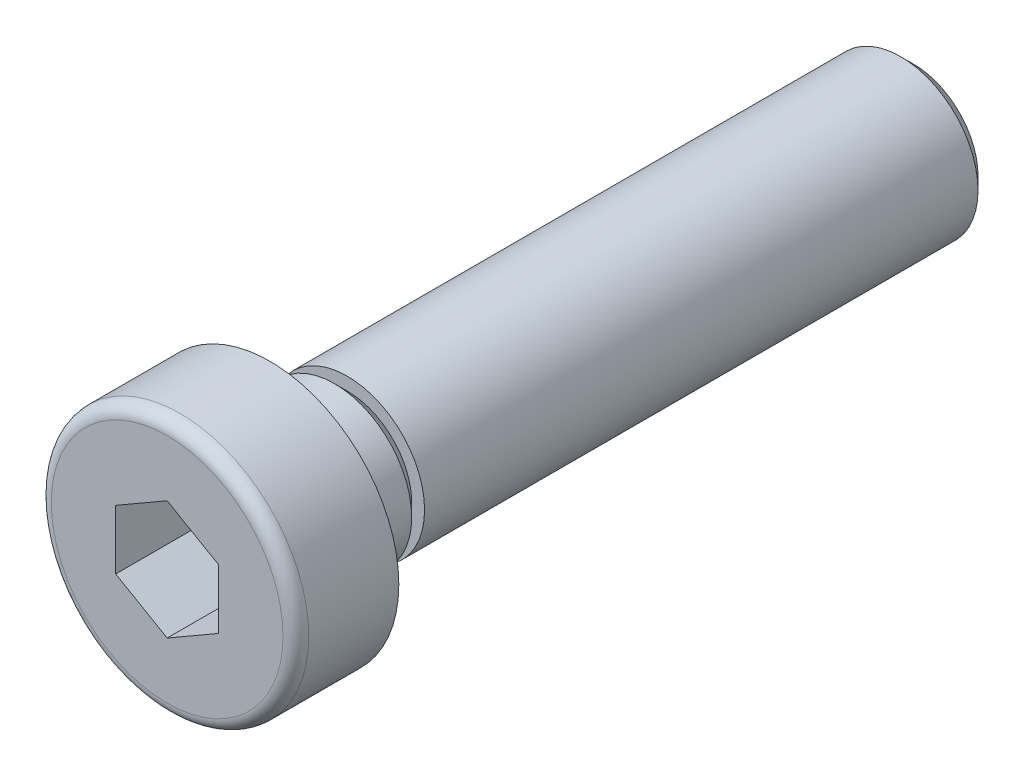
ISO-10303-21;
HEADER;
FILE_DESCRIPTION(('STEP AP214'),'2;1');
FILE_NAME('part.step','',(''),(''),'','','');
FILE_SCHEMA(('AUTOMOTIVE_DESIGN { 1 0 10303 214 1 1 1 1 }'));
ENDSEC;
DATA;
#1=APPLICATION_CONTEXT('core data for automotive mechanical design processes');
#2=APPLICATION_PROTOCOL_DEFINITION('international standard','automotive_design',2000,#1);
#3=PRODUCT_CONTEXT('',#1,'mechanical');
#4=PRODUCT('Part','Part','',(#3));
#5=PRODUCT_RELATED_PRODUCT_CATEGORY('part','',(#4));
#6=PRODUCT_DEFINITION_FORMATION('','',#4);
#7=PRODUCT_DEFINITION_CONTEXT('part definition',#1,'design');
#8=PRODUCT_DEFINITION('design','',#6,#7);
#9=PRODUCT_DEFINITION_SHAPE('','',#8);
#10=(LENGTH_UNIT() NAMED_UNIT(*) SI_UNIT(.MILLI.,.METRE.));
#11=(NAMED_UNIT(*) PLANE_ANGLE_UNIT() SI_UNIT($,.RADIAN.));
#12=(NAMED_UNIT(*) SI_UNIT($,.STERADIAN.) SOLID_ANGLE_UNIT());
#13=UNCERTAINTY_MEASURE_WITH_UNIT(LENGTH_MEASURE(1.E-05),#10,'distance_accuracy_value','');
#14=(GEOMETRIC_REPRESENTATION_CONTEXT(3) GLOBAL_UNCERTAINTY_ASSIGNED_CONTEXT((#13)) GLOBAL_UNIT_ASSIGNED_CONTEXT((#10,
#11,#12)) REPRESENTATION_CONTEXT('',''));
#15=CARTESIAN_POINT('',(0.,0.,0.));
#16=DIRECTION('',(0.,0.,1.));
#17=DIRECTION('',(1.,0.,0.));
#18=AXIS2_PLACEMENT_3D('',#15,#16,#17);
#19=CARTESIAN_POINT('',(-268.749668394775,-161.29907216884,-790.10814798632));
#20=DIRECTION('',(0.,0.,-1.));
#21=DIRECTION('',(-1.,0.,0.));
#22=AXIS2_PLACEMENT_3D('',#19,#20,#21);
#23=PLANE('',#22);
#24=DIRECTION('',(0.,1.,0.));
#25=VECTOR('',#24,1.);
#26=CARTESIAN_POINT('',(-266.749668394775,-161.29907216884,-790.10814798632));
#27=LINE('',#26,#25);
#28=CARTESIAN_POINT('',(-266.749668394775,-162.453772707219,-790.10814798632));
#29=VERTEX_POINT('',#28);
#30=CARTESIAN_POINT('',(-266.749668394775,-160.144371630462,-790.10814798632));
#31=VERTEX_POINT('',#30);
#32=EDGE_CURVE('E343',#29,#31,#27,.T.);
#33=ORIENTED_EDGE('',*,*,#32,.T.);
#34=DIRECTION('',(-0.866025403784439,0.5,0.));
#35=VECTOR('',#34,1.);
#36=CARTESIAN_POINT('',(-267.749668394776,-159.567021361272,-790.10814798632));
#37=LINE('',#36,#35);
#38=CARTESIAN_POINT('',(-268.749668394775,-158.989671092082,-790.10814798632));
#39=VERTEX_POINT('',#38);
#40=EDGE_CURVE('E358',#31,#39,#37,.T.);
#41=ORIENTED_EDGE('',*,*,#40,.T.);
#42=DIRECTION('',(-0.866025403784438,-0.5,0.));
#43=VECTOR('',#42,1.);
#44=CARTESIAN_POINT('',(-269.749668394776,-159.567021361272,-790.10814798632));
#45=LINE('',#44,#43);
#46=CARTESIAN_POINT('',(-270.749668394775,-160.144371630461,-790.10814798632));
#47=VERTEX_POINT('',#46);
#48=EDGE_CURVE('E328',#39,#47,#45,.T.);
#49=ORIENTED_EDGE('',*,*,#48,.T.);
#50=DIRECTION('',(0.,1.,0.));
#51=VECTOR('',#50,1.);
#52=CARTESIAN_POINT('',(-270.749668394775,-161.29907216884,-790.10814798632));
#53=LINE('',#52,#51);
#54=CARTESIAN_POINT('',(-270.749668394775,-162.45377270722,-790.10814798632));
#55=VERTEX_POINT('',#54);
#56=EDGE_CURVE('E80',#47,#55,#53,.F.);
#57=ORIENTED_EDGE('',*,*,#56,.T.);
#58=DIRECTION('',(0.866025403784439,-0.5,0.));
#59=VECTOR('',#58,1.);
#60=CARTESIAN_POINT('',(-269.749668394776,-163.031122976409,-790.10814798632));
#61=LINE('',#60,#59);
#62=CARTESIAN_POINT('',(-268.749668394776,-163.608473245599,-790.10814798632));
#63=VERTEX_POINT('',#62);
#64=EDGE_CURVE('E61',#55,#63,#61,.T.);
#65=ORIENTED_EDGE('',*,*,#64,.T.);
#66=DIRECTION('',(0.866025403784439,0.5,0.));
#67=VECTOR('',#66,1.);
#68=CARTESIAN_POINT('',(-267.749668394776,-163.031122976409,-790.10814798632));
#69=LINE('',#68,#67);
#70=EDGE_CURVE('E67',#63,#29,#69,.T.);
#71=ORIENTED_EDGE('',*,*,#70,.T.);
#72=EDGE_LOOP('',(#33,#41,#49,#57,#65,#71));
#73=FACE_BOUND('',#72,.T.);
#74=ADVANCED_FACE('F17',(#73),#23,.F.);
#75=CARTESIAN_POINT('',(-267.749668394776,-163.031122976409,-786.108147986318));
#76=DIRECTION('',(0.5,-0.866025403784439,0.));
#77=DIRECTION('',(0.866025403784439,0.5,0.));
#78=AXIS2_PLACEMENT_3D('',#75,#76,#77);
#79=PLANE('',#78);
#80=DIRECTION('',(0.,0.,1.));
#81=VECTOR('',#80,1.);
#82=CARTESIAN_POINT('',(-268.749668394775,-163.608473245599,-786.108147986318));
#83=LINE('',#82,#81);
#84=CARTESIAN_POINT('',(-268.749668394776,-163.608473245599,-786.108147986318));
#85=VERTEX_POINT('',#84);
#86=EDGE_CURVE('E71',#63,#85,#83,.T.);
#87=ORIENTED_EDGE('',*,*,#86,.T.);
#88=DIRECTION('',(-0.866025403784596,-0.499999999999727,0.));
#89=VECTOR('',#88,1.);
#90=CARTESIAN_POINT('',(-266.749668394775,-162.45377270722,-786.108147986318));
#91=LINE('',#90,#89);
#92=CARTESIAN_POINT('',(-266.749668394775,-162.453772707219,-786.108147986318));
#93=VERTEX_POINT('',#92);
#94=EDGE_CURVE('E340',#93,#85,#91,.T.);
#95=ORIENTED_EDGE('',*,*,#94,.F.);
#96=DIRECTION('',(0.,0.,1.));
#97=VECTOR('',#96,1.);
#98=CARTESIAN_POINT('',(-266.749668394775,-162.45377270722,-786.108147986318));
#99=LINE('',#98,#97);
#100=EDGE_CURVE('E74',#93,#29,#99,.F.);
#101=ORIENTED_EDGE('',*,*,#100,.T.);
#102=ORIENTED_EDGE('',*,*,#70,.F.);
#103=EDGE_LOOP('',(#87,#95,#101,#102));
#104=FACE_BOUND('',#103,.T.);
#105=ADVANCED_FACE('F68',(#104),#79,.F.);
#106=CARTESIAN_POINT('',(-269.749668394776,-163.031122976409,-786.108147986318));
#107=DIRECTION('',(-0.5,-0.866025403784439,0.));
#108=DIRECTION('',(0.866025403784439,-0.5,0.));
#109=AXIS2_PLACEMENT_3D('',#106,#107,#108);
#110=PLANE('',#109);
#111=DIRECTION('',(0.,0.,1.));
#112=VECTOR('',#111,1.);
#113=CARTESIAN_POINT('',(-270.749668394775,-162.45377270722,-786.108147986318));
#114=LINE('',#113,#112);
#115=CARTESIAN_POINT('',(-270.749668394775,-162.45377270722,-786.108147986318));
#116=VERTEX_POINT('',#115);
#117=EDGE_CURVE('E82',#55,#116,#114,.T.);
#118=ORIENTED_EDGE('',*,*,#117,.T.);
#119=DIRECTION('',(-0.86602540378438,0.500000000000102,0.));
#120=VECTOR('',#119,1.);
#121=CARTESIAN_POINT('',(-268.749668394776,-163.608473245599,-786.108147986318));
#122=LINE('',#121,#120);
#123=EDGE_CURVE('E86',#85,#116,#122,.T.);
#124=ORIENTED_EDGE('',*,*,#123,.F.);
#125=ORIENTED_EDGE('',*,*,#86,.F.);
#126=ORIENTED_EDGE('',*,*,#64,.F.);
#127=EDGE_LOOP('',(#118,#124,#125,#126));
#128=FACE_BOUND('',#127,.T.);
#129=ADVANCED_FACE('F84',(#128),#110,.F.);
#130=CARTESIAN_POINT('',(-270.749668394775,-161.29907216884,-786.108147986318));
#131=DIRECTION('',(-1.,0.,0.));
#132=DIRECTION('',(0.,0.,1.));
#133=AXIS2_PLACEMENT_3D('',#130,#131,#132);
#134=PLANE('',#133);
#135=DIRECTION('',(0.,0.,1.));
#136=VECTOR('',#135,1.);
#137=CARTESIAN_POINT('',(-270.749668394775,-160.144371630461,-786.108147986318));
#138=LINE('',#137,#136);
#139=CARTESIAN_POINT('',(-270.749668394775,-160.14437163046,-786.108147986318));
#140=VERTEX_POINT('',#139);
#141=EDGE_CURVE('E321',#47,#140,#138,.T.);
#142=ORIENTED_EDGE('',*,*,#141,.T.);
#143=DIRECTION('',(0.,1.,0.));
#144=VECTOR('',#143,1.);
#145=CARTESIAN_POINT('',(-270.749668394775,-158.79907216884,-786.108147986318));
#146=LINE('',#145,#144);
#147=EDGE_CURVE('E325',#116,#140,#146,.T.);
#148=ORIENTED_EDGE('',*,*,#147,.F.);
#149=ORIENTED_EDGE('',*,*,#117,.F.);
#150=ORIENTED_EDGE('',*,*,#56,.F.);
#151=EDGE_LOOP('',(#142,#148,#149,#150));
#152=FACE_BOUND('',#151,.T.);
#153=ADVANCED_FACE('F147',(#152),#134,.F.);
#154=CARTESIAN_POINT('',(-269.749668394776,-159.567021361272,-786.108147986318));
#155=DIRECTION('',(-0.5,0.866025403784438,0.));
#156=DIRECTION('',(-0.866025403784438,-0.5,0.));
#157=AXIS2_PLACEMENT_3D('',#154,#155,#156);
#158=PLANE('',#157);
#159=DIRECTION('',(0.,0.,1.));
#160=VECTOR('',#159,1.);
#161=CARTESIAN_POINT('',(-268.749668394776,-158.989671092082,-786.108147986318));
#162=LINE('',#161,#160);
#163=CARTESIAN_POINT('',(-268.749668394775,-158.989671092082,-786.108147986318));
#164=VERTEX_POINT('',#163);
#165=EDGE_CURVE('E334',#39,#164,#162,.T.);
#166=ORIENTED_EDGE('',*,*,#165,.T.);
#167=DIRECTION('',(0.866025403784488,0.499999999999914,0.));
#168=VECTOR('',#167,1.);
#169=CARTESIAN_POINT('',(-270.749668394775,-160.14437163046,-786.108147986318));
#170=LINE('',#169,#168);
#171=EDGE_CURVE('E332',#140,#164,#170,.T.);
#172=ORIENTED_EDGE('',*,*,#171,.F.);
#173=ORIENTED_EDGE('',*,*,#141,.F.);
#174=ORIENTED_EDGE('',*,*,#48,.F.);
#175=EDGE_LOOP('',(#166,#172,#173,#174));
#176=FACE_BOUND('',#175,.T.);
#177=ADVANCED_FACE('F143',(#176),#158,.F.);
#178=CARTESIAN_POINT('',(-267.749668394776,-159.567021361272,-786.108147986318));
#179=DIRECTION('',(0.5,0.866025403784439,0.));
#180=DIRECTION('',(-0.866025403784439,0.5,0.));
#181=AXIS2_PLACEMENT_3D('',#178,#179,#180);
#182=PLANE('',#181);
#183=DIRECTION('',(0.,0.,1.));
#184=VECTOR('',#183,1.);
#185=CARTESIAN_POINT('',(-266.749668394775,-160.144371630461,-786.108147986318));
#186=LINE('',#185,#184);
#187=CARTESIAN_POINT('',(-266.749668394775,-160.144371630462,-786.108147986318));
#188=VERTEX_POINT('',#187);
#189=EDGE_CURVE('E355',#31,#188,#186,.T.);
#190=ORIENTED_EDGE('',*,*,#189,.T.);
#191=DIRECTION('',(0.866025403784113,-0.500000000000563,0.));
#192=VECTOR('',#191,1.);
#193=CARTESIAN_POINT('',(-268.749668394775,-158.989671092081,-786.108147986318));
#194=LINE('',#193,#192);
#195=EDGE_CURVE('E337',#164,#188,#194,.T.);
#196=ORIENTED_EDGE('',*,*,#195,.F.);
#197=ORIENTED_EDGE('',*,*,#165,.F.);
#198=ORIENTED_EDGE('',*,*,#40,.F.);
#199=EDGE_LOOP('',(#190,#196,#197,#198));
#200=FACE_BOUND('',#199,.T.);
#201=ADVANCED_FACE('F139',(#200),#182,.F.);
#202=CARTESIAN_POINT('',(-266.749668394775,-161.29907216884,-786.108147986318));
#203=DIRECTION('',(1.,0.,0.));
#204=DIRECTION('',(0.,1.,0.));
#205=AXIS2_PLACEMENT_3D('',#202,#203,#204);
#206=PLANE('',#205);
#207=ORIENTED_EDGE('',*,*,#100,.F.);
#208=DIRECTION('',(0.,1.,0.));
#209=VECTOR('',#208,1.);
#210=CARTESIAN_POINT('',(-266.749668394775,-158.79907216884,-786.108147986318));
#211=LINE('',#210,#209);
#212=EDGE_CURVE('E111',#188,#93,#211,.F.);
#213=ORIENTED_EDGE('',*,*,#212,.F.);
#214=ORIENTED_EDGE('',*,*,#189,.F.);
#215=ORIENTED_EDGE('',*,*,#32,.F.);
#216=EDGE_LOOP('',(#207,#213,#214,#215));
#217=FACE_BOUND('',#216,.T.);
#218=ADVANCED_FACE('F131',(#217),#206,.F.);
#219=CARTESIAN_POINT('',(-268.749668394775,-158.79907216884,-786.108147986318));
#220=DIRECTION('',(0.,0.,1.));
#221=DIRECTION('',(1.,0.,0.));
#222=AXIS2_PLACEMENT_3D('',#219,#220,#221);
#223=PLANE('',#222);
#224=ORIENTED_EDGE('',*,*,#195,.T.);
#225=ORIENTED_EDGE('',*,*,#212,.T.);
#226=ORIENTED_EDGE('',*,*,#94,.T.);
#227=ORIENTED_EDGE('',*,*,#123,.T.);
#228=ORIENTED_EDGE('',*,*,#147,.T.);
#229=ORIENTED_EDGE('',*,*,#171,.T.);
#230=EDGE_LOOP('',(#224,#225,#226,#227,#228,#229));
#231=FACE_BOUND('',#230,.T.);
#232=CARTESIAN_POINT('',(-268.749668394775,-161.29907216884,-786.108147986318));
#233=DIRECTION('',(0.,0.,-1.));
#234=DIRECTION('',(1.,0.,0.));
#235=AXIS2_PLACEMENT_3D('',#232,#233,#234);
#236=CIRCLE('',#235,4.5);
#237=CARTESIAN_POINT('',(-264.249668394775,-161.29907216884,-786.108147986318));
#238=VERTEX_POINT('',#237);
#239=CARTESIAN_POINT('',(-273.249668394775,-161.29907216884,-786.108147986318));
#240=VERTEX_POINT('',#239);
#241=EDGE_CURVE('E36',#238,#240,#236,.T.);
#242=ORIENTED_EDGE('',*,*,#241,.F.);
#243=CARTESIAN_POINT('',(-268.749668394775,-161.29907216884,-786.108147986318));
#244=DIRECTION('',(0.,0.,-1.));
#245=DIRECTION('',(-1.,0.,0.));
#246=AXIS2_PLACEMENT_3D('',#243,#244,#245);
#247=CIRCLE('',#246,4.5);
#248=EDGE_CURVE('E109',#240,#238,#247,.T.);
#249=ORIENTED_EDGE('',*,*,#248,.F.);
#250=EDGE_LOOP('',(#242,#249));
#251=FACE_BOUND('',#250,.T.);
#252=ADVANCED_FACE('F113',(#231,#251),#223,.T.);
#253=CARTESIAN_POINT('',(-268.749668394775,-161.29907216884,-786.608147986318));
#254=DIRECTION('',(0.,0.,1.));
#255=DIRECTION('',(-1.,0.,0.));
#256=AXIS2_PLACEMENT_3D('',#253,#254,#255);
#257=TOROIDAL_SURFACE('',#256,4.5,0.499999999999999);
#258=ORIENTED_EDGE('',*,*,#241,.T.);
#259=ORIENTED_EDGE('',*,*,#248,.T.);
#260=EDGE_LOOP('',(#258,#259));
#261=FACE_BOUND('',#260,.T.);
#262=CARTESIAN_POINT('',(-268.749668394775,-161.29907216884,-786.608147986318));
#263=DIRECTION('',(0.,0.,1.));
#264=DIRECTION('',(1.,0.,0.));
#265=AXIS2_PLACEMENT_3D('',#262,#263,#264);
#266=CIRCLE('',#265,4.99999999999999);
#267=CARTESIAN_POINT('',(-263.749668394775,-161.29907216884,-786.608147986318));
#268=VERTEX_POINT('',#267);
#269=EDGE_CURVE('E105',#268,#268,#266,.F.);
#270=ORIENTED_EDGE('',*,*,#269,.F.);
#271=EDGE_LOOP('',(#270));
#272=FACE_BOUND('',#271,.T.);
#273=ADVANCED_FACE('F107',(#261,#272),#257,.T.);
#274=CARTESIAN_POINT('',(-268.749668394775,-161.29907216884,-788.10814798632));
#275=DIRECTION('',(0.,0.,1.));
#276=DIRECTION('',(1.,0.,0.));
#277=AXIS2_PLACEMENT_3D('',#274,#275,#276);
#278=CYLINDRICAL_SURFACE('',#277,4.99999999999999);
#279=CARTESIAN_POINT('',(-268.749668394775,-161.29907216884,-790.10814798632));
#280=DIRECTION('',(0.,0.,1.));
#281=DIRECTION('',(1.,0.,0.));
#282=AXIS2_PLACEMENT_3D('',#279,#280,#281);
#283=CIRCLE('',#282,4.99999999999999);
#284=CARTESIAN_POINT('',(-263.749668394775,-161.29907216884,-790.10814798632));
#285=VERTEX_POINT('',#284);
#286=EDGE_CURVE('E103',#285,#285,#283,.F.);
#287=ORIENTED_EDGE('',*,*,#286,.F.);
#288=EDGE_LOOP('',(#287));
#289=FACE_BOUND('',#288,.T.);
#290=ORIENTED_EDGE('',*,*,#269,.T.);
#291=EDGE_LOOP('',(#290));
#292=FACE_BOUND('',#291,.T.);
#293=ADVANCED_FACE('F188',(#289,#292),#278,.T.);
#294=CARTESIAN_POINT('',(-268.749668394775,-157.29907216884,-790.10814798632));
#295=DIRECTION('',(0.,0.,-1.));
#296=DIRECTION('',(-1.,0.,0.));
#297=AXIS2_PLACEMENT_3D('',#294,#295,#296);
#298=PLANE('',#297);
#299=CARTESIAN_POINT('',(-268.749668394775,-161.29907216884,-790.10814798632));
#300=DIRECTION('',(0.,0.,1.));
#301=DIRECTION('',(1.,0.,0.));
#302=AXIS2_PLACEMENT_3D('',#299,#300,#301);
#303=CIRCLE('',#302,2.99999999999999);
#304=CARTESIAN_POINT('',(-265.749668394775,-161.29907216884,-790.10814798632));
#305=VERTEX_POINT('',#304);
#306=EDGE_CURVE('E100',#305,#305,#303,.F.);
#307=ORIENTED_EDGE('',*,*,#306,.F.);
#308=EDGE_LOOP('',(#307));
#309=FACE_BOUND('',#308,.T.);
#310=ORIENTED_EDGE('',*,*,#286,.T.);
#311=EDGE_LOOP('',(#310));
#312=FACE_BOUND('',#311,.T.);
#313=ADVANCED_FACE('F185',(#309,#312),#298,.T.);
#314=CARTESIAN_POINT('',(-268.749668394775,-161.29907216884,-791.35814798632));
#315=DIRECTION('',(0.,0.,1.));
#316=DIRECTION('',(1.,0.,0.));
#317=AXIS2_PLACEMENT_3D('',#314,#315,#316);
#318=CYLINDRICAL_SURFACE('',#317,2.99999999999999);
#319=ORIENTED_EDGE('',*,*,#306,.T.);
#320=EDGE_LOOP('',(#319));
#321=FACE_BOUND('',#320,.T.);
#322=CARTESIAN_POINT('',(-268.749668394775,-161.29907216884,-792.608147986319));
#323=DIRECTION('',(0.,0.,1.));
#324=DIRECTION('',(0.,1.,0.));
#325=AXIS2_PLACEMENT_3D('',#322,#323,#324);
#326=CIRCLE('',#325,3.);
#327=CARTESIAN_POINT('',(-268.749668394775,-158.29907216884,-792.608147986319));
#328=VERTEX_POINT('',#327);
#329=EDGE_CURVE('E99',#328,#328,#326,.F.);
#330=ORIENTED_EDGE('',*,*,#329,.F.);
#331=EDGE_LOOP('',(#330));
#332=FACE_BOUND('',#331,.T.);
#333=ADVANCED_FACE('F181',(#321,#332),#318,.T.);
#334=CARTESIAN_POINT('',(-268.749668394775,-161.29907216884,-792.608147986319));
#335=DIRECTION('',(0.,0.,1.));
#336=DIRECTION('',(1.,0.,0.));
#337=AXIS2_PLACEMENT_3D('',#334,#335,#336);
#338=CONICAL_SURFACE('',#337,3.,0.785398163397448);
#339=CARTESIAN_POINT('',(-268.749668394775,-161.29907216884,-793.108147986318));
#340=DIRECTION('',(0.,0.,1.));
#341=DIRECTION('',(1.,0.,0.));
#342=AXIS2_PLACEMENT_3D('',#339,#340,#341);
#343=CIRCLE('',#342,2.5000000000005);
#344=CARTESIAN_POINT('',(-266.249668394774,-161.29907216884,-793.108147986318));
#345=VERTEX_POINT('',#344);
#346=EDGE_CURVE('E96',#345,#345,#343,.F.);
#347=ORIENTED_EDGE('',*,*,#346,.F.);
#348=EDGE_LOOP('',(#347));
#349=FACE_BOUND('',#348,.T.);
#350=ORIENTED_EDGE('',*,*,#329,.T.);
#351=EDGE_LOOP('',(#350));
#352=FACE_BOUND('',#351,.T.);
#353=ADVANCED_FACE('F177',(#349,#352),#338,.T.);
#354=CARTESIAN_POINT('',(-268.749668394775,-160.049072168841,-815.108147986319));
#355=DIRECTION('',(0.,0.,-1.));
#356=DIRECTION('',(-1.,0.,0.));
#357=AXIS2_PLACEMENT_3D('',#354,#355,#356);
#358=PLANE('',#357);
#359=CARTESIAN_POINT('',(-268.749668394775,-161.29907216884,-815.108147986319));
#360=DIRECTION('',(0.,0.,1.));
#361=DIRECTION('',(1.,0.,0.));
#362=AXIS2_PLACEMENT_3D('',#359,#360,#361);
#363=CIRCLE('',#362,2.50000000000028);
#364=CARTESIAN_POINT('',(-266.249668394775,-161.29907216884,-815.108147986319));
#365=VERTEX_POINT('',#364);
#366=EDGE_CURVE('E93',#365,#365,#363,.T.);
#367=ORIENTED_EDGE('',*,*,#366,.F.);
#368=EDGE_LOOP('',(#367));
#369=FACE_BOUND('',#368,.T.);
#370=ADVANCED_FACE('F173',(#369),#358,.T.);
#371=CARTESIAN_POINT('',(-268.749668394775,-158.54907216884,-793.108147986318));
#372=DIRECTION('',(0.,0.,1.));
#373=DIRECTION('',(1.,0.,0.));
#374=AXIS2_PLACEMENT_3D('',#371,#372,#373);
#375=PLANE('',#374);
#376=ORIENTED_EDGE('',*,*,#346,.T.);
#377=EDGE_LOOP('',(#376));
#378=FACE_BOUND('',#377,.T.);
#379=CARTESIAN_POINT('',(-268.749668394775,-161.29907216884,-793.108147986318));
#380=DIRECTION('',(0.,0.,1.));
#381=DIRECTION('',(1.,0.,0.));
#382=AXIS2_PLACEMENT_3D('',#379,#380,#381);
#383=CIRCLE('',#382,2.99999999999999);
#384=CARTESIAN_POINT('',(-265.749668394775,-161.29907216884,-793.108147986318));
#385=VERTEX_POINT('',#384);
#386=EDGE_CURVE('E28',#385,#385,#383,.F.);
#387=ORIENTED_EDGE('',*,*,#386,.F.);
#388=EDGE_LOOP('',(#387));
#389=FACE_BOUND('',#388,.T.);
#390=ADVANCED_FACE('F166',(#378,#389),#375,.T.);
#391=CARTESIAN_POINT('',(-268.749668394775,-161.29907216884,-814.608147986319));
#392=DIRECTION('',(0.,0.,1.));
#393=DIRECTION('',(1.,0.,0.));
#394=AXIS2_PLACEMENT_3D('',#391,#392,#393);
#395=CONICAL_SURFACE('',#394,3.,0.785398163397476);
#396=CARTESIAN_POINT('',(-268.749668394775,-161.29907216884,-814.608147986319));
#397=DIRECTION('',(0.,0.,1.));
#398=DIRECTION('',(1.,0.,0.));
#399=AXIS2_PLACEMENT_3D('',#396,#397,#398);
#400=CIRCLE('',#399,2.99999999999999);
#401=CARTESIAN_POINT('',(-265.749668394775,-161.29907216884,-814.608147986319));
#402=VERTEX_POINT('',#401);
#403=EDGE_CURVE('E11',#402,#402,#400,.T.);
#404=ORIENTED_EDGE('',*,*,#403,.F.);
#405=EDGE_LOOP('',(#404));
#406=FACE_BOUND('',#405,.T.);
#407=ORIENTED_EDGE('',*,*,#366,.T.);
#408=EDGE_LOOP('',(#407));
#409=FACE_BOUND('',#408,.T.);
#410=ADVANCED_FACE('F160',(#406,#409),#395,.T.);
#411=CARTESIAN_POINT('',(-268.749668394775,-161.29907216884,-803.858147986318));
#412=DIRECTION('',(0.,0.,1.));
#413=DIRECTION('',(1.,0.,0.));
#414=AXIS2_PLACEMENT_3D('',#411,#412,#413);
#415=CYLINDRICAL_SURFACE('',#414,2.99999999999999);
#416=ORIENTED_EDGE('',*,*,#403,.T.);
#417=EDGE_LOOP('',(#416));
#418=FACE_BOUND('',#417,.T.);
#419=ORIENTED_EDGE('',*,*,#386,.T.);
#420=EDGE_LOOP('',(#419));
#421=FACE_BOUND('',#420,.T.);
#422=ADVANCED_FACE('F158',(#418,#421),#415,.T.);
#423=CLOSED_SHELL('',(#74,#105,#129,#153,#177,#201,#218,#252,#273,#293,#313,#333,#353,#370,#390,
#410,#422));
#424=MANIFOLD_SOLID_BREP('B1',#423);
#425=ADVANCED_BREP_SHAPE_REPRESENTATION('',(#18,#424),#14);
#426=SHAPE_DEFINITION_REPRESENTATION(#9,#425);
ENDSEC;
END-ISO-10303-21;
